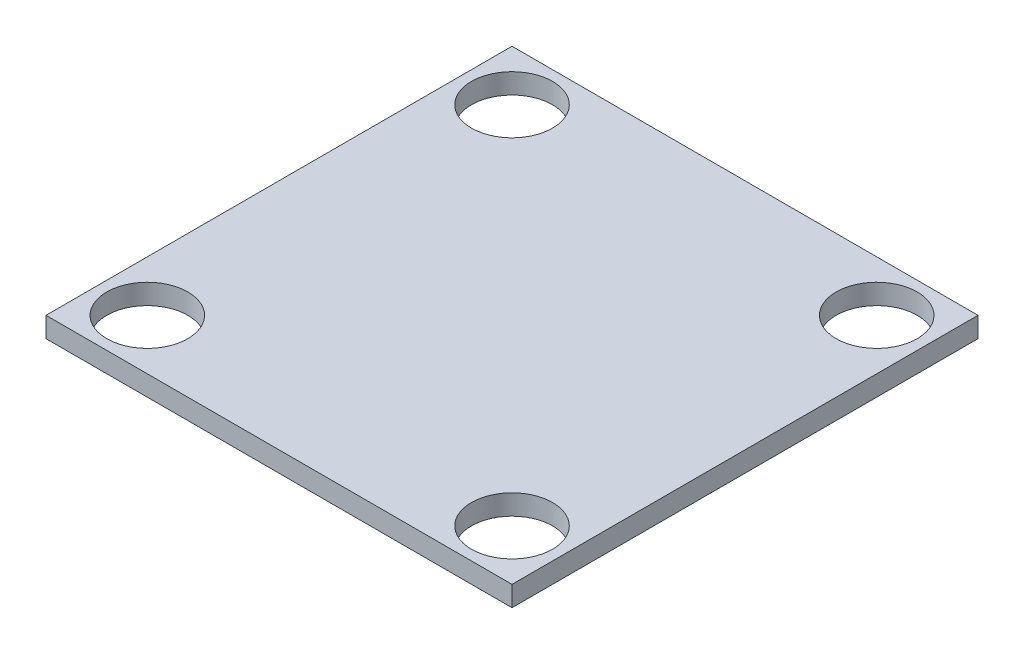
ISO-10303-21;
HEADER;
FILE_DESCRIPTION(('STEP AP214'),'2;1');
FILE_NAME('part.step','',(''),(''),'','','');
FILE_SCHEMA(('AUTOMOTIVE_DESIGN { 1 0 10303 214 1 1 1 1 }'));
ENDSEC;
DATA;
#1=APPLICATION_CONTEXT('core data for automotive mechanical design processes');
#2=APPLICATION_PROTOCOL_DEFINITION('international standard','automotive_design',2000,#1);
#3=PRODUCT_CONTEXT('',#1,'mechanical');
#4=PRODUCT('Part','Part','',(#3));
#5=PRODUCT_RELATED_PRODUCT_CATEGORY('part','',(#4));
#6=PRODUCT_DEFINITION_FORMATION('','',#4);
#7=PRODUCT_DEFINITION_CONTEXT('part definition',#1,'design');
#8=PRODUCT_DEFINITION('design','',#6,#7);
#9=PRODUCT_DEFINITION_SHAPE('','',#8);
#10=(LENGTH_UNIT() NAMED_UNIT(*) SI_UNIT(.MILLI.,.METRE.));
#11=(NAMED_UNIT(*) PLANE_ANGLE_UNIT() SI_UNIT($,.RADIAN.));
#12=(NAMED_UNIT(*) SI_UNIT($,.STERADIAN.) SOLID_ANGLE_UNIT());
#13=UNCERTAINTY_MEASURE_WITH_UNIT(LENGTH_MEASURE(1.E-05),#10,'distance_accuracy_value','');
#14=(GEOMETRIC_REPRESENTATION_CONTEXT(3) GLOBAL_UNCERTAINTY_ASSIGNED_CONTEXT((#13)) GLOBAL_UNIT_ASSIGNED_CONTEXT((#10,
#11,#12)) REPRESENTATION_CONTEXT('',''));
#15=CARTESIAN_POINT('',(0.,0.,0.));
#16=DIRECTION('',(0.,0.,1.));
#17=DIRECTION('',(1.,0.,0.));
#18=AXIS2_PLACEMENT_3D('',#15,#16,#17);
#19=CARTESIAN_POINT('',(11.5,0.5,11.5));
#20=DIRECTION('',(-1.,0.,0.));
#21=DIRECTION('',(0.,0.,1.));
#22=AXIS2_PLACEMENT_3D('',#19,#20,#21);
#23=PLANE('',#22);
#24=DIRECTION('',(0.,0.,-1.));
#25=VECTOR('',#24,1.);
#26=CARTESIAN_POINT('',(11.5,-0.5,11.5));
#27=LINE('',#26,#25);
#28=CARTESIAN_POINT('',(11.5,-0.5,11.5));
#29=VERTEX_POINT('',#28);
#30=CARTESIAN_POINT('',(11.5,-0.5,-11.5));
#31=VERTEX_POINT('',#30);
#32=EDGE_CURVE('E96',#29,#31,#27,.T.);
#33=ORIENTED_EDGE('',*,*,#32,.T.);
#34=DIRECTION('',(0.,-1.,0.));
#35=VECTOR('',#34,1.);
#36=CARTESIAN_POINT('',(11.5,0.5,-11.5));
#37=LINE('',#36,#35);
#38=CARTESIAN_POINT('',(11.5,0.5,-11.5));
#39=VERTEX_POINT('',#38);
#40=EDGE_CURVE('E11',#39,#31,#37,.T.);
#41=ORIENTED_EDGE('',*,*,#40,.F.);
#42=DIRECTION('',(0.,0.,-1.));
#43=VECTOR('',#42,1.);
#44=CARTESIAN_POINT('',(11.5,0.5,11.5));
#45=LINE('',#44,#43);
#46=CARTESIAN_POINT('',(11.5,0.5,11.5));
#47=VERTEX_POINT('',#46);
#48=EDGE_CURVE('E84',#47,#39,#45,.T.);
#49=ORIENTED_EDGE('',*,*,#48,.F.);
#50=DIRECTION('',(0.,-1.,0.));
#51=VECTOR('',#50,1.);
#52=CARTESIAN_POINT('',(11.5,0.5,11.5));
#53=LINE('',#52,#51);
#54=EDGE_CURVE('E92',#47,#29,#53,.T.);
#55=ORIENTED_EDGE('',*,*,#54,.T.);
#56=EDGE_LOOP('',(#33,#41,#49,#55));
#57=FACE_BOUND('',#56,.T.);
#58=ADVANCED_FACE('F33',(#57),#23,.F.);
#59=CARTESIAN_POINT('',(-11.5,0.5,-11.5));
#60=DIRECTION('',(0.,0.,1.));
#61=DIRECTION('',(1.,0.,0.));
#62=AXIS2_PLACEMENT_3D('',#59,#60,#61);
#63=PLANE('',#62);
#64=DIRECTION('',(-1.,0.,0.));
#65=VECTOR('',#64,1.);
#66=CARTESIAN_POINT('',(-11.5,-0.5,-11.5));
#67=LINE('',#66,#65);
#68=CARTESIAN_POINT('',(-11.5,-0.5,-11.5));
#69=VERTEX_POINT('',#68);
#70=EDGE_CURVE('E88',#31,#69,#67,.T.);
#71=ORIENTED_EDGE('',*,*,#70,.T.);
#72=DIRECTION('',(0.,-1.,0.));
#73=VECTOR('',#72,1.);
#74=CARTESIAN_POINT('',(-11.5,0.5,-11.5));
#75=LINE('',#74,#73);
#76=CARTESIAN_POINT('',(-11.5,0.5,-11.5));
#77=VERTEX_POINT('',#76);
#78=EDGE_CURVE('E41',#77,#69,#75,.T.);
#79=ORIENTED_EDGE('',*,*,#78,.F.);
#80=DIRECTION('',(-1.,0.,0.));
#81=VECTOR('',#80,1.);
#82=CARTESIAN_POINT('',(-11.5,0.5,-11.5));
#83=LINE('',#82,#81);
#84=EDGE_CURVE('E79',#39,#77,#83,.T.);
#85=ORIENTED_EDGE('',*,*,#84,.F.);
#86=ORIENTED_EDGE('',*,*,#40,.T.);
#87=EDGE_LOOP('',(#71,#79,#85,#86));
#88=FACE_BOUND('',#87,.T.);
#89=ADVANCED_FACE('F87',(#88),#63,.F.);
#90=CARTESIAN_POINT('',(-11.5,0.5,11.5));
#91=DIRECTION('',(1.,0.,0.));
#92=DIRECTION('',(0.,0.,-1.));
#93=AXIS2_PLACEMENT_3D('',#90,#91,#92);
#94=PLANE('',#93);
#95=DIRECTION('',(0.,0.,1.));
#96=VECTOR('',#95,1.);
#97=CARTESIAN_POINT('',(-11.5,-0.5,11.5));
#98=LINE('',#97,#96);
#99=CARTESIAN_POINT('',(-11.5,-0.5,11.5));
#100=VERTEX_POINT('',#99);
#101=EDGE_CURVE('E66',#69,#100,#98,.T.);
#102=ORIENTED_EDGE('',*,*,#101,.T.);
#103=DIRECTION('',(0.,-1.,0.));
#104=VECTOR('',#103,1.);
#105=CARTESIAN_POINT('',(-11.5,0.5,11.5));
#106=LINE('',#105,#104);
#107=CARTESIAN_POINT('',(-11.5,0.5,11.5));
#108=VERTEX_POINT('',#107);
#109=EDGE_CURVE('E89',#108,#100,#106,.T.);
#110=ORIENTED_EDGE('',*,*,#109,.F.);
#111=DIRECTION('',(0.,0.,1.));
#112=VECTOR('',#111,1.);
#113=CARTESIAN_POINT('',(-11.5,0.5,11.5));
#114=LINE('',#113,#112);
#115=EDGE_CURVE('E82',#77,#108,#114,.T.);
#116=ORIENTED_EDGE('',*,*,#115,.F.);
#117=ORIENTED_EDGE('',*,*,#78,.T.);
#118=EDGE_LOOP('',(#102,#110,#116,#117));
#119=FACE_BOUND('',#118,.T.);
#120=ADVANCED_FACE('F90',(#119),#94,.F.);
#121=CARTESIAN_POINT('',(-11.5,0.5,11.5));
#122=DIRECTION('',(0.,0.,-1.));
#123=DIRECTION('',(-1.,0.,0.));
#124=AXIS2_PLACEMENT_3D('',#121,#122,#123);
#125=PLANE('',#124);
#126=DIRECTION('',(1.,0.,0.));
#127=VECTOR('',#126,1.);
#128=CARTESIAN_POINT('',(-11.5,-0.5,11.5));
#129=LINE('',#128,#127);
#130=EDGE_CURVE('E72',#100,#29,#129,.T.);
#131=ORIENTED_EDGE('',*,*,#130,.T.);
#132=ORIENTED_EDGE('',*,*,#54,.F.);
#133=DIRECTION('',(1.,0.,0.));
#134=VECTOR('',#133,1.);
#135=CARTESIAN_POINT('',(-11.5,0.5,11.5));
#136=LINE('',#135,#134);
#137=EDGE_CURVE('E49',#108,#47,#136,.T.);
#138=ORIENTED_EDGE('',*,*,#137,.F.);
#139=ORIENTED_EDGE('',*,*,#109,.T.);
#140=EDGE_LOOP('',(#131,#132,#138,#139));
#141=FACE_BOUND('',#140,.T.);
#142=ADVANCED_FACE('F104',(#141),#125,.F.);
#143=CARTESIAN_POINT('',(0.,0.5,0.));
#144=DIRECTION('',(0.,-1.,0.));
#145=DIRECTION('',(0.,0.,-1.));
#146=AXIS2_PLACEMENT_3D('',#143,#144,#145);
#147=PLANE('',#146);
#148=CARTESIAN_POINT('',(9.,0.5,-9.));
#149=DIRECTION('',(0.,1.,0.));
#150=DIRECTION('',(0.,0.,1.));
#151=AXIS2_PLACEMENT_3D('',#148,#149,#150);
#152=CIRCLE('',#151,2.);
#153=CARTESIAN_POINT('',(9.,0.5,-7.));
#154=VERTEX_POINT('',#153);
#155=EDGE_CURVE('E130',#154,#154,#152,.T.);
#156=ORIENTED_EDGE('',*,*,#155,.F.);
#157=EDGE_LOOP('',(#156));
#158=FACE_BOUND('',#157,.T.);
#159=CARTESIAN_POINT('',(-9.,0.5,9.));
#160=DIRECTION('',(0.,1.,0.));
#161=DIRECTION('',(0.,0.,1.));
#162=AXIS2_PLACEMENT_3D('',#159,#160,#161);
#163=CIRCLE('',#162,2.);
#164=CARTESIAN_POINT('',(-9.,0.5,11.));
#165=VERTEX_POINT('',#164);
#166=EDGE_CURVE('E124',#165,#165,#163,.T.);
#167=ORIENTED_EDGE('',*,*,#166,.F.);
#168=EDGE_LOOP('',(#167));
#169=FACE_BOUND('',#168,.T.);
#170=CARTESIAN_POINT('',(-9.,0.5,-9.));
#171=DIRECTION('',(0.,1.,0.));
#172=DIRECTION('',(0.,0.,1.));
#173=AXIS2_PLACEMENT_3D('',#170,#171,#172);
#174=CIRCLE('',#173,2.);
#175=CARTESIAN_POINT('',(-9.,0.5,-7.));
#176=VERTEX_POINT('',#175);
#177=EDGE_CURVE('E118',#176,#176,#174,.T.);
#178=ORIENTED_EDGE('',*,*,#177,.F.);
#179=EDGE_LOOP('',(#178));
#180=FACE_BOUND('',#179,.T.);
#181=CARTESIAN_POINT('',(9.,0.5,9.));
#182=DIRECTION('',(0.,1.,0.));
#183=DIRECTION('',(0.,0.,1.));
#184=AXIS2_PLACEMENT_3D('',#181,#182,#183);
#185=CIRCLE('',#184,2.);
#186=CARTESIAN_POINT('',(9.,0.5,11.));
#187=VERTEX_POINT('',#186);
#188=EDGE_CURVE('E112',#187,#187,#185,.T.);
#189=ORIENTED_EDGE('',*,*,#188,.F.);
#190=EDGE_LOOP('',(#189));
#191=FACE_BOUND('',#190,.T.);
#192=ORIENTED_EDGE('',*,*,#48,.T.);
#193=ORIENTED_EDGE('',*,*,#84,.T.);
#194=ORIENTED_EDGE('',*,*,#115,.T.);
#195=ORIENTED_EDGE('',*,*,#137,.T.);
#196=EDGE_LOOP('',(#192,#193,#194,#195));
#197=FACE_BOUND('',#196,.T.);
#198=ADVANCED_FACE('F80',(#158,#169,#180,#191,#197),#147,.F.);
#199=CARTESIAN_POINT('',(0.,-0.5,0.));
#200=DIRECTION('',(0.,-1.,0.));
#201=DIRECTION('',(0.,0.,-1.));
#202=AXIS2_PLACEMENT_3D('',#199,#200,#201);
#203=PLANE('',#202);
#204=CARTESIAN_POINT('',(9.,-0.5,-9.));
#205=DIRECTION('',(0.,1.,0.));
#206=DIRECTION('',(0.,0.,1.));
#207=AXIS2_PLACEMENT_3D('',#204,#205,#206);
#208=CIRCLE('',#207,2.);
#209=CARTESIAN_POINT('',(9.,-0.5,-7.));
#210=VERTEX_POINT('',#209);
#211=EDGE_CURVE('E127',#210,#210,#208,.T.);
#212=ORIENTED_EDGE('',*,*,#211,.T.);
#213=EDGE_LOOP('',(#212));
#214=FACE_BOUND('',#213,.T.);
#215=CARTESIAN_POINT('',(-9.,-0.5,9.));
#216=DIRECTION('',(0.,1.,0.));
#217=DIRECTION('',(0.,0.,1.));
#218=AXIS2_PLACEMENT_3D('',#215,#216,#217);
#219=CIRCLE('',#218,2.);
#220=CARTESIAN_POINT('',(-9.,-0.5,11.));
#221=VERTEX_POINT('',#220);
#222=EDGE_CURVE('E121',#221,#221,#219,.T.);
#223=ORIENTED_EDGE('',*,*,#222,.T.);
#224=EDGE_LOOP('',(#223));
#225=FACE_BOUND('',#224,.T.);
#226=CARTESIAN_POINT('',(-9.,-0.5,-9.));
#227=DIRECTION('',(0.,1.,0.));
#228=DIRECTION('',(0.,0.,1.));
#229=AXIS2_PLACEMENT_3D('',#226,#227,#228);
#230=CIRCLE('',#229,2.);
#231=CARTESIAN_POINT('',(-9.,-0.5,-7.));
#232=VERTEX_POINT('',#231);
#233=EDGE_CURVE('E115',#232,#232,#230,.T.);
#234=ORIENTED_EDGE('',*,*,#233,.T.);
#235=EDGE_LOOP('',(#234));
#236=FACE_BOUND('',#235,.T.);
#237=CARTESIAN_POINT('',(9.,-0.5,9.));
#238=DIRECTION('',(0.,1.,0.));
#239=DIRECTION('',(0.,0.,1.));
#240=AXIS2_PLACEMENT_3D('',#237,#238,#239);
#241=CIRCLE('',#240,2.);
#242=CARTESIAN_POINT('',(9.,-0.5,11.));
#243=VERTEX_POINT('',#242);
#244=EDGE_CURVE('E99',#243,#243,#241,.T.);
#245=ORIENTED_EDGE('',*,*,#244,.T.);
#246=EDGE_LOOP('',(#245));
#247=FACE_BOUND('',#246,.T.);
#248=ORIENTED_EDGE('',*,*,#32,.F.);
#249=ORIENTED_EDGE('',*,*,#130,.F.);
#250=ORIENTED_EDGE('',*,*,#101,.F.);
#251=ORIENTED_EDGE('',*,*,#70,.F.);
#252=EDGE_LOOP('',(#248,#249,#250,#251));
#253=FACE_BOUND('',#252,.T.);
#254=ADVANCED_FACE('F107',(#214,#225,#236,#247,#253),#203,.T.);
#255=CARTESIAN_POINT('',(9.,0.5,9.));
#256=DIRECTION('',(0.,1.,0.));
#257=DIRECTION('',(0.,0.,1.));
#258=AXIS2_PLACEMENT_3D('',#255,#256,#257);
#259=CYLINDRICAL_SURFACE('',#258,2.);
#260=ORIENTED_EDGE('',*,*,#244,.F.);
#261=EDGE_LOOP('',(#260));
#262=FACE_BOUND('',#261,.T.);
#263=ORIENTED_EDGE('',*,*,#188,.T.);
#264=EDGE_LOOP('',(#263));
#265=FACE_BOUND('',#264,.T.);
#266=ADVANCED_FACE('F145',(#262,#265),#259,.F.);
#267=CARTESIAN_POINT('',(-9.,0.5,-9.));
#268=DIRECTION('',(0.,1.,0.));
#269=DIRECTION('',(0.,0.,1.));
#270=AXIS2_PLACEMENT_3D('',#267,#268,#269);
#271=CYLINDRICAL_SURFACE('',#270,2.);
#272=ORIENTED_EDGE('',*,*,#233,.F.);
#273=EDGE_LOOP('',(#272));
#274=FACE_BOUND('',#273,.T.);
#275=ORIENTED_EDGE('',*,*,#177,.T.);
#276=EDGE_LOOP('',(#275));
#277=FACE_BOUND('',#276,.T.);
#278=ADVANCED_FACE('F147',(#274,#277),#271,.F.);
#279=CARTESIAN_POINT('',(-9.,0.5,9.));
#280=DIRECTION('',(0.,1.,0.));
#281=DIRECTION('',(0.,0.,1.));
#282=AXIS2_PLACEMENT_3D('',#279,#280,#281);
#283=CYLINDRICAL_SURFACE('',#282,2.);
#284=ORIENTED_EDGE('',*,*,#222,.F.);
#285=EDGE_LOOP('',(#284));
#286=FACE_BOUND('',#285,.T.);
#287=ORIENTED_EDGE('',*,*,#166,.T.);
#288=EDGE_LOOP('',(#287));
#289=FACE_BOUND('',#288,.T.);
#290=ADVANCED_FACE('F154',(#286,#289),#283,.F.);
#291=CARTESIAN_POINT('',(9.,0.5,-9.));
#292=DIRECTION('',(0.,1.,0.));
#293=DIRECTION('',(0.,0.,1.));
#294=AXIS2_PLACEMENT_3D('',#291,#292,#293);
#295=CYLINDRICAL_SURFACE('',#294,2.);
#296=ORIENTED_EDGE('',*,*,#211,.F.);
#297=EDGE_LOOP('',(#296));
#298=FACE_BOUND('',#297,.T.);
#299=ORIENTED_EDGE('',*,*,#155,.T.);
#300=EDGE_LOOP('',(#299));
#301=FACE_BOUND('',#300,.T.);
#302=ADVANCED_FACE('F134',(#298,#301),#295,.F.);
#303=CLOSED_SHELL('',(#58,#89,#120,#142,#198,#254,#266,#278,#290,#302));
#304=MANIFOLD_SOLID_BREP('B2',#303);
#305=ADVANCED_BREP_SHAPE_REPRESENTATION('',(#18,#304),#14);
#306=SHAPE_DEFINITION_REPRESENTATION(#9,#305);
ENDSEC;
END-ISO-10303-21;
